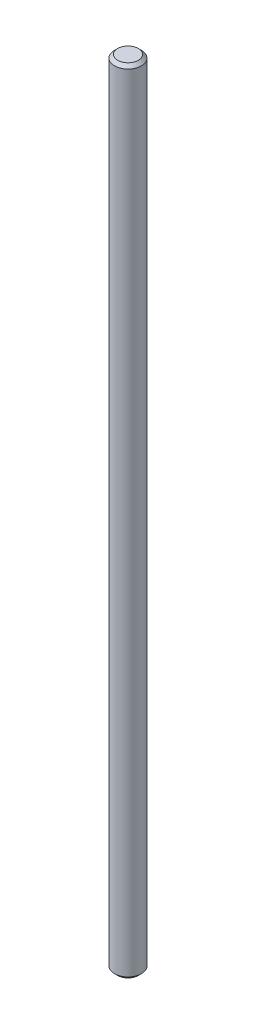
ISO-10303-21;
HEADER;
FILE_DESCRIPTION(('STEP AP214'),'2;1');
FILE_NAME('part.step','',(''),(''),'','','');
FILE_SCHEMA(('AUTOMOTIVE_DESIGN { 1 0 10303 214 1 1 1 1 }'));
ENDSEC;
DATA;
#1=APPLICATION_CONTEXT('core data for automotive mechanical design processes');
#2=APPLICATION_PROTOCOL_DEFINITION('international standard','automotive_design',2000,#1);
#3=PRODUCT_CONTEXT('',#1,'mechanical');
#4=PRODUCT('Part','Part','',(#3));
#5=PRODUCT_RELATED_PRODUCT_CATEGORY('part','',(#4));
#6=PRODUCT_DEFINITION_FORMATION('','',#4);
#7=PRODUCT_DEFINITION_CONTEXT('part definition',#1,'design');
#8=PRODUCT_DEFINITION('design','',#6,#7);
#9=PRODUCT_DEFINITION_SHAPE('','',#8);
#10=(LENGTH_UNIT() NAMED_UNIT(*) SI_UNIT(.MILLI.,.METRE.));
#11=(NAMED_UNIT(*) PLANE_ANGLE_UNIT() SI_UNIT($,.RADIAN.));
#12=(NAMED_UNIT(*) SI_UNIT($,.STERADIAN.) SOLID_ANGLE_UNIT());
#13=UNCERTAINTY_MEASURE_WITH_UNIT(LENGTH_MEASURE(1.E-05),#10,'distance_accuracy_value','');
#14=(GEOMETRIC_REPRESENTATION_CONTEXT(3) GLOBAL_UNCERTAINTY_ASSIGNED_CONTEXT((#13)) GLOBAL_UNIT_ASSIGNED_CONTEXT((#10,
#11,#12)) REPRESENTATION_CONTEXT('',''));
#15=CARTESIAN_POINT('',(0.,0.,0.));
#16=DIRECTION('',(0.,0.,1.));
#17=DIRECTION('',(1.,0.,0.));
#18=AXIS2_PLACEMENT_3D('',#15,#16,#17);
#19=CARTESIAN_POINT('',(0.,250.,0.));
#20=DIRECTION('',(0.,-1.,0.));
#21=DIRECTION('',(0.,0.,-1.));
#22=AXIS2_PLACEMENT_3D('',#19,#20,#21);
#23=CYLINDRICAL_SURFACE('',#22,4.25);
#24=CARTESIAN_POINT('',(0.,0.999999999999945,0.));
#25=DIRECTION('',(0.,1.,0.));
#26=DIRECTION('',(0.,0.,1.));
#27=AXIS2_PLACEMENT_3D('',#24,#25,#26);
#28=CIRCLE('',#27,4.25);
#29=CARTESIAN_POINT('',(0.,0.999999999999945,4.25));
#30=VERTEX_POINT('',#29);
#31=EDGE_CURVE('E42',#30,#30,#28,.T.);
#32=ORIENTED_EDGE('',*,*,#31,.T.);
#33=EDGE_LOOP('',(#32));
#34=FACE_BOUND('',#33,.T.);
#35=CARTESIAN_POINT('',(0.,249.,0.));
#36=DIRECTION('',(0.,1.,0.));
#37=DIRECTION('',(0.,0.,1.));
#38=AXIS2_PLACEMENT_3D('',#35,#36,#37);
#39=CIRCLE('',#38,4.25);
#40=CARTESIAN_POINT('',(0.,249.,4.25));
#41=VERTEX_POINT('',#40);
#42=EDGE_CURVE('E46',#41,#41,#39,.F.);
#43=ORIENTED_EDGE('',*,*,#42,.T.);
#44=EDGE_LOOP('',(#43));
#45=FACE_BOUND('',#44,.T.);
#46=ADVANCED_FACE('F35',(#34,#45),#23,.T.);
#47=CARTESIAN_POINT('',(0.,250.,0.));
#48=DIRECTION('',(0.,1.,0.));
#49=DIRECTION('',(0.,0.,1.));
#50=AXIS2_PLACEMENT_3D('',#47,#48,#49);
#51=PLANE('',#50);
#52=CARTESIAN_POINT('',(0.,250.,0.));
#53=DIRECTION('',(0.,1.,0.));
#54=DIRECTION('',(0.,0.,1.));
#55=AXIS2_PLACEMENT_3D('',#52,#53,#54);
#56=CIRCLE('',#55,3.24999999999998);
#57=CARTESIAN_POINT('',(0.,250.,3.24999999999998));
#58=VERTEX_POINT('',#57);
#59=EDGE_CURVE('E50',#58,#58,#56,.T.);
#60=ORIENTED_EDGE('',*,*,#59,.T.);
#61=EDGE_LOOP('',(#60));
#62=FACE_BOUND('',#61,.T.);
#63=ADVANCED_FACE('F56',(#62),#51,.T.);
#64=CARTESIAN_POINT('',(0.,0.,0.));
#65=DIRECTION('',(0.,1.,0.));
#66=DIRECTION('',(0.,0.,1.));
#67=AXIS2_PLACEMENT_3D('',#64,#65,#66);
#68=PLANE('',#67);
#69=CARTESIAN_POINT('',(0.,0.,0.));
#70=DIRECTION('',(0.,1.,0.));
#71=DIRECTION('',(0.,0.,1.));
#72=AXIS2_PLACEMENT_3D('',#69,#70,#71);
#73=CIRCLE('',#72,3.25000000000003);
#74=CARTESIAN_POINT('',(0.,0.,3.25000000000003));
#75=VERTEX_POINT('',#74);
#76=EDGE_CURVE('E10',#75,#75,#73,.F.);
#77=ORIENTED_EDGE('',*,*,#76,.T.);
#78=EDGE_LOOP('',(#77));
#79=FACE_BOUND('',#78,.T.);
#80=ADVANCED_FACE('F60',(#79),#68,.F.);
#81=CARTESIAN_POINT('',(0.,250.,0.));
#82=DIRECTION('',(0.,-1.,0.));
#83=DIRECTION('',(0.,0.,-1.));
#84=AXIS2_PLACEMENT_3D('',#81,#82,#83);
#85=CONICAL_SURFACE('',#84,3.24999999999998,0.785398163397447);
#86=ORIENTED_EDGE('',*,*,#42,.F.);
#87=EDGE_LOOP('',(#86));
#88=FACE_BOUND('',#87,.T.);
#89=ORIENTED_EDGE('',*,*,#59,.F.);
#90=EDGE_LOOP('',(#89));
#91=FACE_BOUND('',#90,.T.);
#92=ADVANCED_FACE('F58',(#88,#91),#85,.T.);
#93=CARTESIAN_POINT('',(0.,0.999999999999945,0.));
#94=DIRECTION('',(0.,1.,0.));
#95=DIRECTION('',(0.,0.,1.));
#96=AXIS2_PLACEMENT_3D('',#93,#94,#95);
#97=CONICAL_SURFACE('',#96,4.25,0.78539816339746);
#98=ORIENTED_EDGE('',*,*,#76,.F.);
#99=EDGE_LOOP('',(#98));
#100=FACE_BOUND('',#99,.T.);
#101=ORIENTED_EDGE('',*,*,#31,.F.);
#102=EDGE_LOOP('',(#101));
#103=FACE_BOUND('',#102,.T.);
#104=ADVANCED_FACE('F37',(#100,#103),#97,.T.);
#105=CLOSED_SHELL('',(#46,#63,#80,#92,#104));
#106=MANIFOLD_SOLID_BREP('B2',#105);
#107=ADVANCED_BREP_SHAPE_REPRESENTATION('',(#18,#106),#14);
#108=SHAPE_DEFINITION_REPRESENTATION(#9,#107);
ENDSEC;
END-ISO-10303-21;
